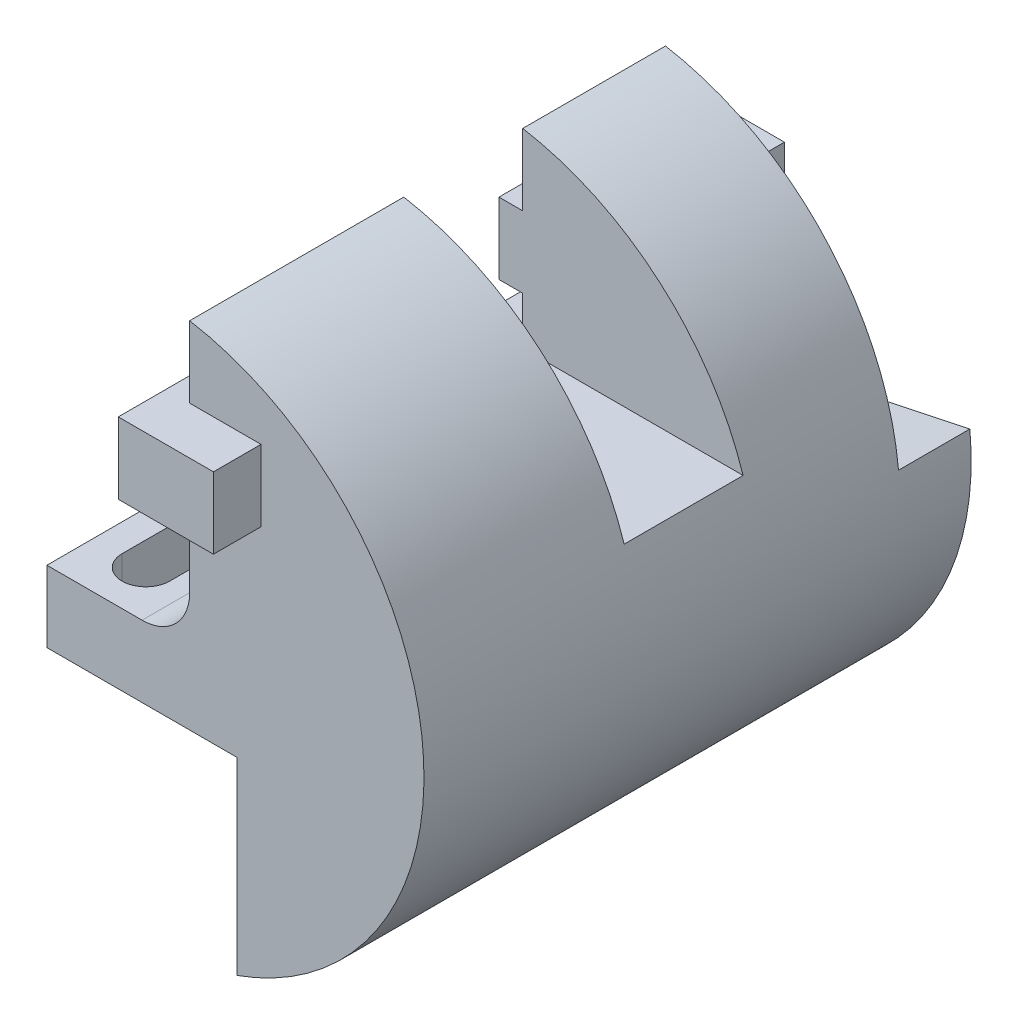
ISO-10303-21;
HEADER;
FILE_DESCRIPTION(('STEP AP214'),'2;1');
FILE_NAME('part.step','',(''),(''),'','','');
FILE_SCHEMA(('AUTOMOTIVE_DESIGN { 1 0 10303 214 1 1 1 1 }'));
ENDSEC;
DATA;
#1=APPLICATION_CONTEXT('core data for automotive mechanical design processes');
#2=APPLICATION_PROTOCOL_DEFINITION('international standard','automotive_design',2000,#1);
#3=PRODUCT_CONTEXT('',#1,'mechanical');
#4=PRODUCT('Part','Part','',(#3));
#5=PRODUCT_RELATED_PRODUCT_CATEGORY('part','',(#4));
#6=PRODUCT_DEFINITION_FORMATION('','',#4);
#7=PRODUCT_DEFINITION_CONTEXT('part definition',#1,'design');
#8=PRODUCT_DEFINITION('design','',#6,#7);
#9=PRODUCT_DEFINITION_SHAPE('','',#8);
#10=(LENGTH_UNIT() NAMED_UNIT(*) SI_UNIT(.MILLI.,.METRE.));
#11=(NAMED_UNIT(*) PLANE_ANGLE_UNIT() SI_UNIT($,.RADIAN.));
#12=(NAMED_UNIT(*) SI_UNIT($,.STERADIAN.) SOLID_ANGLE_UNIT());
#13=UNCERTAINTY_MEASURE_WITH_UNIT(LENGTH_MEASURE(1.E-05),#10,'distance_accuracy_value','');
#14=(GEOMETRIC_REPRESENTATION_CONTEXT(3) GLOBAL_UNCERTAINTY_ASSIGNED_CONTEXT((#13)) GLOBAL_UNIT_ASSIGNED_CONTEXT((#10,
#11,#12)) REPRESENTATION_CONTEXT('',''));
#15=CARTESIAN_POINT('',(0.,0.,0.));
#16=DIRECTION('',(0.,0.,1.));
#17=DIRECTION('',(1.,0.,0.));
#18=AXIS2_PLACEMENT_3D('',#15,#16,#17);
#19=CARTESIAN_POINT('',(0.,0.,0.));
#20=DIRECTION('',(0.,0.,-1.));
#21=DIRECTION('',(-1.,0.,0.));
#22=AXIS2_PLACEMENT_3D('',#19,#20,#21);
#23=PLANE('',#22);
#24=CARTESIAN_POINT('',(0.,0.,0.));
#25=DIRECTION('',(0.,0.,1.));
#26=DIRECTION('',(-1.,0.,0.));
#27=AXIS2_PLACEMENT_3D('',#24,#25,#26);
#28=CIRCLE('',#27,59.25);
#29=CARTESIAN_POINT('',(58.9764421708089,5.68698240486387,0.));
#30=VERTEX_POINT('',#29);
#31=CARTESIAN_POINT('',(10.,58.4000214041057,0.));
#32=VERTEX_POINT('',#31);
#33=EDGE_CURVE('E329',#30,#32,#28,.T.);
#34=ORIENTED_EDGE('',*,*,#33,.F.);
#35=DIRECTION('',(0.978147600733806,0.207911690817756,0.));
#36=VECTOR('',#35,1.);
#37=CARTESIAN_POINT('',(1.39283859257965,-6.55279038029392,0.));
#38=LINE('',#37,#36);
#39=CARTESIAN_POINT('',(-20.,-11.0999785958943,0.));
#40=VERTEX_POINT('',#39);
#41=EDGE_CURVE('E485',#40,#30,#38,.T.);
#42=ORIENTED_EDGE('',*,*,#41,.F.);
#43=DIRECTION('',(0.,-1.,0.));
#44=VECTOR('',#43,1.);
#45=CARTESIAN_POINT('',(-20.,-1.09997859589433,0.));
#46=LINE('',#45,#44);
#47=CARTESIAN_POINT('',(-20.,-1.09997859589433,0.));
#48=VERTEX_POINT('',#47);
#49=EDGE_CURVE('E332',#48,#40,#46,.T.);
#50=ORIENTED_EDGE('',*,*,#49,.F.);
#51=DIRECTION('',(-1.,0.,0.));
#52=VECTOR('',#51,1.);
#53=CARTESIAN_POINT('',(-20.,-1.09997859589433,0.));
#54=LINE('',#53,#52);
#55=CARTESIAN_POINT('',(0.,-1.09997859589433,0.));
#56=VERTEX_POINT('',#55);
#57=EDGE_CURVE('E315',#56,#48,#54,.T.);
#58=ORIENTED_EDGE('',*,*,#57,.F.);
#59=CARTESIAN_POINT('',(0.,8.90002140410567,0.));
#60=DIRECTION('',(0.,0.,-1.));
#61=DIRECTION('',(1.,0.,0.));
#62=AXIS2_PLACEMENT_3D('',#59,#60,#61);
#63=CIRCLE('',#62,10.);
#64=CARTESIAN_POINT('',(10.,8.90002140410567,0.));
#65=VERTEX_POINT('',#64);
#66=EDGE_CURVE('E319',#65,#56,#63,.T.);
#67=ORIENTED_EDGE('',*,*,#66,.F.);
#68=DIRECTION('',(0.,-1.,0.));
#69=VECTOR('',#68,1.);
#70=CARTESIAN_POINT('',(10.,8.90002140410567,0.));
#71=LINE('',#70,#69);
#72=CARTESIAN_POINT('',(10.,28.4000214041057,0.));
#73=VERTEX_POINT('',#72);
#74=EDGE_CURVE('E322',#73,#65,#71,.T.);
#75=ORIENTED_EDGE('',*,*,#74,.F.);
#76=DIRECTION('',(-1.,0.,0.));
#77=VECTOR('',#76,1.);
#78=CARTESIAN_POINT('',(25.,28.4000214041057,0.));
#79=LINE('',#78,#77);
#80=CARTESIAN_POINT('',(25.,28.4000214041057,0.));
#81=VERTEX_POINT('',#80);
#82=EDGE_CURVE('E401',#81,#73,#79,.T.);
#83=ORIENTED_EDGE('',*,*,#82,.F.);
#84=DIRECTION('',(0.,-1.,0.));
#85=VECTOR('',#84,1.);
#86=CARTESIAN_POINT('',(25.,43.4000214041057,0.));
#87=LINE('',#86,#85);
#88=CARTESIAN_POINT('',(25.,43.4000214041057,0.));
#89=VERTEX_POINT('',#88);
#90=EDGE_CURVE('E406',#89,#81,#87,.T.);
#91=ORIENTED_EDGE('',*,*,#90,.F.);
#92=DIRECTION('',(1.,0.,0.));
#93=VECTOR('',#92,1.);
#94=CARTESIAN_POINT('',(5.,43.4000214041057,0.));
#95=LINE('',#94,#93);
#96=CARTESIAN_POINT('',(10.,43.4000214041057,0.));
#97=VERTEX_POINT('',#96);
#98=EDGE_CURVE('E266',#97,#89,#95,.T.);
#99=ORIENTED_EDGE('',*,*,#98,.F.);
#100=DIRECTION('',(0.,-1.,0.));
#101=VECTOR('',#100,1.);
#102=CARTESIAN_POINT('',(10.,43.4000214041057,0.));
#103=LINE('',#102,#101);
#104=EDGE_CURVE('E325',#32,#97,#103,.T.);
#105=ORIENTED_EDGE('',*,*,#104,.F.);
#106=EDGE_LOOP('',(#34,#42,#50,#58,#67,#75,#83,#91,#99,#105));
#107=FACE_BOUND('',#106,.T.);
#108=ADVANCED_FACE('F47',(#107),#23,.T.);
#109=CARTESIAN_POINT('',(10.,43.4000214041057,100.));
#110=DIRECTION('',(1.,0.,0.));
#111=DIRECTION('',(0.,1.,0.));
#112=AXIS2_PLACEMENT_3D('',#109,#110,#111);
#113=PLANE('',#112);
#114=DIRECTION('',(0.,0.,-1.));
#115=VECTOR('',#114,1.);
#116=CARTESIAN_POINT('',(10.,58.4000214041057,100.));
#117=LINE('',#116,#115);
#118=CARTESIAN_POINT('',(10.,58.4000214041057,100.));
#119=VERTEX_POINT('',#118);
#120=CARTESIAN_POINT('',(10.,58.4000214041057,55.));
#121=VERTEX_POINT('',#120);
#122=EDGE_CURVE('E277',#119,#121,#117,.T.);
#123=ORIENTED_EDGE('',*,*,#122,.T.);
#124=DIRECTION('',(0.,-1.,0.));
#125=VECTOR('',#124,1.);
#126=CARTESIAN_POINT('',(10.,43.4000214041057,55.));
#127=LINE('',#126,#125);
#128=CARTESIAN_POINT('',(10.,43.4000214041057,55.));
#129=VERTEX_POINT('',#128);
#130=EDGE_CURVE('E429',#121,#129,#127,.T.);
#131=ORIENTED_EDGE('',*,*,#130,.T.);
#132=DIRECTION('',(0.,0.,-1.));
#133=VECTOR('',#132,1.);
#134=CARTESIAN_POINT('',(10.,43.4000214041057,100.));
#135=LINE('',#134,#133);
#136=CARTESIAN_POINT('',(10.,43.4000214041057,100.));
#137=VERTEX_POINT('',#136);
#138=EDGE_CURVE('E282',#137,#129,#135,.T.);
#139=ORIENTED_EDGE('',*,*,#138,.F.);
#140=DIRECTION('',(0.,-1.,0.));
#141=VECTOR('',#140,1.);
#142=CARTESIAN_POINT('',(10.,43.4000214041057,100.));
#143=LINE('',#142,#141);
#144=EDGE_CURVE('E345',#119,#137,#143,.T.);
#145=ORIENTED_EDGE('',*,*,#144,.F.);
#146=EDGE_LOOP('',(#123,#131,#139,#145));
#147=FACE_BOUND('',#146,.T.);
#148=ADVANCED_FACE('F610',(#147),#113,.F.);
#149=CARTESIAN_POINT('',(5.,43.4000214041057,100.));
#150=DIRECTION('',(0.,-1.,0.));
#151=DIRECTION('',(0.,0.,-1.));
#152=AXIS2_PLACEMENT_3D('',#149,#150,#151);
#153=PLANE('',#152);
#154=ORIENTED_EDGE('',*,*,#138,.T.);
#155=DIRECTION('',(-1.,0.,0.));
#156=VECTOR('',#155,1.);
#157=CARTESIAN_POINT('',(5.,43.4000214041057,55.));
#158=LINE('',#157,#156);
#159=CARTESIAN_POINT('',(5.,43.4000214041057,55.));
#160=VERTEX_POINT('',#159);
#161=EDGE_CURVE('E433',#129,#160,#158,.T.);
#162=ORIENTED_EDGE('',*,*,#161,.T.);
#163=DIRECTION('',(0.,0.,-1.));
#164=VECTOR('',#163,1.);
#165=CARTESIAN_POINT('',(5.,43.4000214041057,100.));
#166=LINE('',#165,#164);
#167=CARTESIAN_POINT('',(5.,43.4000214041057,110.));
#168=VERTEX_POINT('',#167);
#169=EDGE_CURVE('E287',#168,#160,#166,.T.);
#170=ORIENTED_EDGE('',*,*,#169,.F.);
#171=DIRECTION('',(-1.,0.,0.));
#172=VECTOR('',#171,1.);
#173=CARTESIAN_POINT('',(5.,43.4000214041057,110.));
#174=LINE('',#173,#172);
#175=CARTESIAN_POINT('',(25.,43.4000214041057,110.));
#176=VERTEX_POINT('',#175);
#177=EDGE_CURVE('E367',#176,#168,#174,.T.);
#178=ORIENTED_EDGE('',*,*,#177,.F.);
#179=DIRECTION('',(0.,0.,-1.));
#180=VECTOR('',#179,1.);
#181=CARTESIAN_POINT('',(25.,43.4000214041057,110.));
#182=LINE('',#181,#180);
#183=CARTESIAN_POINT('',(25.,43.4000214041057,100.));
#184=VERTEX_POINT('',#183);
#185=EDGE_CURVE('E363',#176,#184,#182,.T.);
#186=ORIENTED_EDGE('',*,*,#185,.T.);
#187=DIRECTION('',(-1.,0.,0.));
#188=VECTOR('',#187,1.);
#189=CARTESIAN_POINT('',(5.,43.4000214041057,100.));
#190=LINE('',#189,#188);
#191=EDGE_CURVE('E368',#184,#137,#190,.T.);
#192=ORIENTED_EDGE('',*,*,#191,.T.);
#193=EDGE_LOOP('',(#154,#162,#170,#178,#186,#192));
#194=FACE_BOUND('',#193,.T.);
#195=ADVANCED_FACE('F616',(#194),#153,.F.);
#196=CARTESIAN_POINT('',(5.,28.4000214041057,100.));
#197=DIRECTION('',(1.,0.,0.));
#198=DIRECTION('',(0.,0.,-1.));
#199=AXIS2_PLACEMENT_3D('',#196,#197,#198);
#200=PLANE('',#199);
#201=ORIENTED_EDGE('',*,*,#169,.T.);
#202=DIRECTION('',(0.,-1.,0.));
#203=VECTOR('',#202,1.);
#204=CARTESIAN_POINT('',(5.,28.4000214041057,55.));
#205=LINE('',#204,#203);
#206=CARTESIAN_POINT('',(5.,28.4000214041057,55.));
#207=VERTEX_POINT('',#206);
#208=EDGE_CURVE('E437',#160,#207,#205,.T.);
#209=ORIENTED_EDGE('',*,*,#208,.T.);
#210=DIRECTION('',(0.,0.,-1.));
#211=VECTOR('',#210,1.);
#212=CARTESIAN_POINT('',(5.,28.4000214041057,100.));
#213=LINE('',#212,#211);
#214=CARTESIAN_POINT('',(5.,28.4000214041057,110.));
#215=VERTEX_POINT('',#214);
#216=EDGE_CURVE('E292',#215,#207,#213,.T.);
#217=ORIENTED_EDGE('',*,*,#216,.F.);
#218=DIRECTION('',(0.,-1.,0.));
#219=VECTOR('',#218,1.);
#220=CARTESIAN_POINT('',(5.,28.4000214041057,110.));
#221=LINE('',#220,#219);
#222=EDGE_CURVE('E372',#168,#215,#221,.T.);
#223=ORIENTED_EDGE('',*,*,#222,.F.);
#224=EDGE_LOOP('',(#201,#209,#217,#223));
#225=FACE_BOUND('',#224,.T.);
#226=ADVANCED_FACE('F637',(#225),#200,.F.);
#227=CARTESIAN_POINT('',(10.,28.4000214041057,100.));
#228=DIRECTION('',(0.,1.,0.));
#229=DIRECTION('',(0.,0.,1.));
#230=AXIS2_PLACEMENT_3D('',#227,#228,#229);
#231=PLANE('',#230);
#232=ORIENTED_EDGE('',*,*,#216,.T.);
#233=DIRECTION('',(1.,0.,0.));
#234=VECTOR('',#233,1.);
#235=CARTESIAN_POINT('',(10.,28.4000214041057,55.));
#236=LINE('',#235,#234);
#237=CARTESIAN_POINT('',(10.,28.4000214041057,55.));
#238=VERTEX_POINT('',#237);
#239=EDGE_CURVE('E441',#207,#238,#236,.T.);
#240=ORIENTED_EDGE('',*,*,#239,.T.);
#241=DIRECTION('',(0.,0.,-1.));
#242=VECTOR('',#241,1.);
#243=CARTESIAN_POINT('',(10.,28.4000214041057,100.));
#244=LINE('',#243,#242);
#245=CARTESIAN_POINT('',(10.,28.4000214041057,100.));
#246=VERTEX_POINT('',#245);
#247=EDGE_CURVE('E297',#246,#238,#244,.T.);
#248=ORIENTED_EDGE('',*,*,#247,.F.);
#249=DIRECTION('',(1.,0.,0.));
#250=VECTOR('',#249,1.);
#251=CARTESIAN_POINT('',(25.,28.4000214041057,100.));
#252=LINE('',#251,#250);
#253=CARTESIAN_POINT('',(25.,28.4000214041057,100.));
#254=VERTEX_POINT('',#253);
#255=EDGE_CURVE('E270',#246,#254,#252,.T.);
#256=ORIENTED_EDGE('',*,*,#255,.T.);
#257=DIRECTION('',(0.,0.,-1.));
#258=VECTOR('',#257,1.);
#259=CARTESIAN_POINT('',(25.,28.4000214041057,110.));
#260=LINE('',#259,#258);
#261=CARTESIAN_POINT('',(25.,28.4000214041057,110.));
#262=VERTEX_POINT('',#261);
#263=EDGE_CURVE('E336',#262,#254,#260,.T.);
#264=ORIENTED_EDGE('',*,*,#263,.F.);
#265=DIRECTION('',(1.,0.,0.));
#266=VECTOR('',#265,1.);
#267=CARTESIAN_POINT('',(25.,28.4000214041057,110.));
#268=LINE('',#267,#266);
#269=EDGE_CURVE('E387',#215,#262,#268,.T.);
#270=ORIENTED_EDGE('',*,*,#269,.F.);
#271=EDGE_LOOP('',(#232,#240,#248,#256,#264,#270));
#272=FACE_BOUND('',#271,.T.);
#273=ADVANCED_FACE('F634',(#272),#231,.F.);
#274=CARTESIAN_POINT('',(0.,0.,100.));
#275=DIRECTION('',(0.,0.,-1.));
#276=DIRECTION('',(-1.,0.,0.));
#277=AXIS2_PLACEMENT_3D('',#274,#275,#276);
#278=PLANE('',#277);
#279=ORIENTED_EDGE('',*,*,#191,.F.);
#280=DIRECTION('',(0.,1.,0.));
#281=VECTOR('',#280,1.);
#282=CARTESIAN_POINT('',(25.,43.4000214041057,100.));
#283=LINE('',#282,#281);
#284=EDGE_CURVE('E373',#254,#184,#283,.T.);
#285=ORIENTED_EDGE('',*,*,#284,.F.);
#286=ORIENTED_EDGE('',*,*,#255,.F.);
#287=DIRECTION('',(0.,-1.,0.));
#288=VECTOR('',#287,1.);
#289=CARTESIAN_POINT('',(10.,8.90002140410567,100.));
#290=LINE('',#289,#288);
#291=CARTESIAN_POINT('',(10.,8.90002140410567,100.));
#292=VERTEX_POINT('',#291);
#293=EDGE_CURVE('E342',#246,#292,#290,.T.);
#294=ORIENTED_EDGE('',*,*,#293,.T.);
#295=CARTESIAN_POINT('',(0.,8.90002140410567,100.));
#296=DIRECTION('',(0.,0.,-1.));
#297=DIRECTION('',(1.,0.,0.));
#298=AXIS2_PLACEMENT_3D('',#295,#296,#297);
#299=CIRCLE('',#298,10.);
#300=CARTESIAN_POINT('',(0.,-1.09997859589433,100.));
#301=VERTEX_POINT('',#300);
#302=EDGE_CURVE('E339',#292,#301,#299,.T.);
#303=ORIENTED_EDGE('',*,*,#302,.T.);
#304=DIRECTION('',(-1.,0.,0.));
#305=VECTOR('',#304,1.);
#306=CARTESIAN_POINT('',(-20.,-1.09997859589433,100.));
#307=LINE('',#306,#305);
#308=CARTESIAN_POINT('',(-20.,-1.09997859589433,100.));
#309=VERTEX_POINT('',#308);
#310=EDGE_CURVE('E314',#301,#309,#307,.T.);
#311=ORIENTED_EDGE('',*,*,#310,.T.);
#312=DIRECTION('',(0.,-1.,0.));
#313=VECTOR('',#312,1.);
#314=CARTESIAN_POINT('',(-20.,-1.09997859589433,100.));
#315=LINE('',#314,#313);
#316=CARTESIAN_POINT('',(-20.,-16.0999785958943,100.));
#317=VERTEX_POINT('',#316);
#318=EDGE_CURVE('E318',#309,#317,#315,.T.);
#319=ORIENTED_EDGE('',*,*,#318,.T.);
#320=DIRECTION('',(1.,0.,0.));
#321=VECTOR('',#320,1.);
#322=CARTESIAN_POINT('',(-20.,-16.0999785958943,100.));
#323=LINE('',#322,#321);
#324=CARTESIAN_POINT('',(20.,-16.0999785958943,100.));
#325=VERTEX_POINT('',#324);
#326=EDGE_CURVE('E354',#317,#325,#323,.T.);
#327=ORIENTED_EDGE('',*,*,#326,.T.);
#328=DIRECTION('',(0.,-1.,0.));
#329=VECTOR('',#328,1.);
#330=CARTESIAN_POINT('',(20.,-16.0999785958943,100.));
#331=LINE('',#330,#329);
#332=CARTESIAN_POINT('',(20.,-55.7724170177338,100.));
#333=VERTEX_POINT('',#332);
#334=EDGE_CURVE('E351',#325,#333,#331,.T.);
#335=ORIENTED_EDGE('',*,*,#334,.T.);
#336=CARTESIAN_POINT('',(0.,0.,100.));
#337=DIRECTION('',(0.,0.,1.));
#338=DIRECTION('',(-1.,0.,0.));
#339=AXIS2_PLACEMENT_3D('',#336,#337,#338);
#340=CIRCLE('',#339,59.25);
#341=EDGE_CURVE('E348',#333,#119,#340,.T.);
#342=ORIENTED_EDGE('',*,*,#341,.T.);
#343=ORIENTED_EDGE('',*,*,#144,.T.);
#344=EDGE_LOOP('',(#279,#285,#286,#294,#303,#311,#319,#327,#335,#342,#343));
#345=FACE_BOUND('',#344,.T.);
#346=ADVANCED_FACE('F621',(#345),#278,.F.);
#347=CARTESIAN_POINT('',(-20.,-1.09997859589433,100.));
#348=DIRECTION('',(1.,0.,0.));
#349=DIRECTION('',(0.,1.,0.));
#350=AXIS2_PLACEMENT_3D('',#347,#348,#349);
#351=PLANE('',#350);
#352=ORIENTED_EDGE('',*,*,#49,.T.);
#353=DIRECTION('',(0.,0.,1.));
#354=VECTOR('',#353,1.);
#355=CARTESIAN_POINT('',(-20.,-11.0999785958943,-15.));
#356=LINE('',#355,#354);
#357=CARTESIAN_POINT('',(-20.,-11.0999785958943,-15.));
#358=VERTEX_POINT('',#357);
#359=EDGE_CURVE('E474',#358,#40,#356,.T.);
#360=ORIENTED_EDGE('',*,*,#359,.F.);
#361=DIRECTION('',(0.,1.,0.));
#362=VECTOR('',#361,1.);
#363=CARTESIAN_POINT('',(-20.,0.,-15.));
#364=LINE('',#363,#362);
#365=CARTESIAN_POINT('',(-20.,-16.0999785958943,-15.));
#366=VERTEX_POINT('',#365);
#367=EDGE_CURVE('E488',#366,#358,#364,.T.);
#368=ORIENTED_EDGE('',*,*,#367,.F.);
#369=DIRECTION('',(0.,0.,-1.));
#370=VECTOR('',#369,1.);
#371=CARTESIAN_POINT('',(-20.,-16.0999785958943,100.));
#372=LINE('',#371,#370);
#373=EDGE_CURVE('E267',#317,#366,#372,.T.);
#374=ORIENTED_EDGE('',*,*,#373,.F.);
#375=ORIENTED_EDGE('',*,*,#318,.F.);
#376=DIRECTION('',(0.,0.,-1.));
#377=VECTOR('',#376,1.);
#378=CARTESIAN_POINT('',(-20.,-1.09997859589433,100.));
#379=LINE('',#378,#377);
#380=EDGE_CURVE('E310',#309,#48,#379,.T.);
#381=ORIENTED_EDGE('',*,*,#380,.T.);
#382=EDGE_LOOP('',(#352,#360,#368,#374,#375,#381));
#383=FACE_BOUND('',#382,.T.);
#384=ADVANCED_FACE('F49',(#383),#351,.F.);
#385=CARTESIAN_POINT('',(-20.,-16.0999785958943,100.));
#386=DIRECTION('',(0.,1.,0.));
#387=DIRECTION('',(0.,0.,1.));
#388=AXIS2_PLACEMENT_3D('',#385,#386,#387);
#389=PLANE('',#388);
#390=DIRECTION('',(0.,0.,-1.));
#391=VECTOR('',#390,1.);
#392=CARTESIAN_POINT('',(-4.20198133159444,-16.0999785958943,100.));
#393=LINE('',#392,#391);
#394=CARTESIAN_POINT('',(-4.20198133159444,-16.0999785958943,90.));
#395=VERTEX_POINT('',#394);
#396=CARTESIAN_POINT('',(-4.20198133159445,-16.0999785958943,10.));
#397=VERTEX_POINT('',#396);
#398=EDGE_CURVE('E510',#395,#397,#393,.T.);
#399=ORIENTED_EDGE('',*,*,#398,.T.);
#400=CARTESIAN_POINT('',(-9.20198133159445,-16.0999785958943,10.));
#401=DIRECTION('',(0.,1.,0.));
#402=DIRECTION('',(0.,0.,1.));
#403=AXIS2_PLACEMENT_3D('',#400,#401,#402);
#404=CIRCLE('',#403,5.);
#405=CARTESIAN_POINT('',(-14.2019813315944,-16.0999785958943,10.));
#406=VERTEX_POINT('',#405);
#407=EDGE_CURVE('E489',#397,#406,#404,.T.);
#408=ORIENTED_EDGE('',*,*,#407,.T.);
#409=DIRECTION('',(0.,0.,1.));
#410=VECTOR('',#409,1.);
#411=CARTESIAN_POINT('',(-14.2019813315944,-16.0999785958943,100.));
#412=LINE('',#411,#410);
#413=CARTESIAN_POINT('',(-14.2019813315944,-16.0999785958943,90.));
#414=VERTEX_POINT('',#413);
#415=EDGE_CURVE('E516',#406,#414,#412,.T.);
#416=ORIENTED_EDGE('',*,*,#415,.T.);
#417=CARTESIAN_POINT('',(-9.20198133159444,-16.0999785958943,90.));
#418=DIRECTION('',(0.,1.,0.));
#419=DIRECTION('',(0.,0.,1.));
#420=AXIS2_PLACEMENT_3D('',#417,#418,#419);
#421=CIRCLE('',#420,5.);
#422=EDGE_CURVE('E243',#414,#395,#421,.T.);
#423=ORIENTED_EDGE('',*,*,#422,.T.);
#424=EDGE_LOOP('',(#399,#408,#416,#423));
#425=FACE_BOUND('',#424,.T.);
#426=ORIENTED_EDGE('',*,*,#373,.T.);
#427=DIRECTION('',(-1.,0.,0.));
#428=VECTOR('',#427,1.);
#429=CARTESIAN_POINT('',(0.,-16.0999785958943,-15.));
#430=LINE('',#429,#428);
#431=CARTESIAN_POINT('',(20.,-16.0999785958943,-15.));
#432=VERTEX_POINT('',#431);
#433=EDGE_CURVE('E484',#432,#366,#430,.T.);
#434=ORIENTED_EDGE('',*,*,#433,.F.);
#435=DIRECTION('',(0.,0.,-1.));
#436=VECTOR('',#435,1.);
#437=CARTESIAN_POINT('',(20.,-16.0999785958943,100.));
#438=LINE('',#437,#436);
#439=EDGE_CURVE('E271',#325,#432,#438,.T.);
#440=ORIENTED_EDGE('',*,*,#439,.F.);
#441=ORIENTED_EDGE('',*,*,#326,.F.);
#442=EDGE_LOOP('',(#426,#434,#440,#441));
#443=FACE_BOUND('',#442,.T.);
#444=ADVANCED_FACE('F532',(#425,#443),#389,.F.);
#445=CARTESIAN_POINT('',(20.,-16.0999785958943,100.));
#446=DIRECTION('',(1.,0.,0.));
#447=DIRECTION('',(0.,1.,0.));
#448=AXIS2_PLACEMENT_3D('',#445,#446,#447);
#449=PLANE('',#448);
#450=ORIENTED_EDGE('',*,*,#439,.T.);
#451=DIRECTION('',(0.,1.,0.));
#452=VECTOR('',#451,1.);
#453=CARTESIAN_POINT('',(20.,0.,-15.));
#454=LINE('',#453,#452);
#455=CARTESIAN_POINT('',(20.,-55.7724170177338,-15.));
#456=VERTEX_POINT('',#455);
#457=EDGE_CURVE('E493',#456,#432,#454,.T.);
#458=ORIENTED_EDGE('',*,*,#457,.F.);
#459=DIRECTION('',(0.,0.,-1.));
#460=VECTOR('',#459,1.);
#461=CARTESIAN_POINT('',(20.,-55.7724170177338,100.));
#462=LINE('',#461,#460);
#463=EDGE_CURVE('E274',#333,#456,#462,.T.);
#464=ORIENTED_EDGE('',*,*,#463,.F.);
#465=ORIENTED_EDGE('',*,*,#334,.F.);
#466=EDGE_LOOP('',(#450,#458,#464,#465));
#467=FACE_BOUND('',#466,.T.);
#468=ADVANCED_FACE('F535',(#467),#449,.F.);
#469=CARTESIAN_POINT('',(0.,0.,100.));
#470=DIRECTION('',(0.,0.,-1.));
#471=DIRECTION('',(-1.,0.,0.));
#472=AXIS2_PLACEMENT_3D('',#469,#470,#471);
#473=CYLINDRICAL_SURFACE('',#472,59.25);
#474=DIRECTION('',(0.,0.,-1.));
#475=VECTOR('',#474,1.);
#476=CARTESIAN_POINT('',(56.3205265629544,18.4000214041057,100.));
#477=LINE('',#476,#475);
#478=CARTESIAN_POINT('',(56.3205265629544,18.4000214041057,30.));
#479=VERTEX_POINT('',#478);
#480=CARTESIAN_POINT('',(56.3205265629544,18.4000214041057,55.));
#481=VERTEX_POINT('',#480);
#482=EDGE_CURVE('E445',#479,#481,#477,.F.);
#483=ORIENTED_EDGE('',*,*,#482,.T.);
#484=CARTESIAN_POINT('',(0.,0.,55.));
#485=DIRECTION('',(0.,0.,1.));
#486=DIRECTION('',(1.,0.,0.));
#487=AXIS2_PLACEMENT_3D('',#484,#485,#486);
#488=CIRCLE('',#487,59.25);
#489=EDGE_CURVE('E410',#481,#121,#488,.T.);
#490=ORIENTED_EDGE('',*,*,#489,.T.);
#491=ORIENTED_EDGE('',*,*,#122,.F.);
#492=ORIENTED_EDGE('',*,*,#341,.F.);
#493=ORIENTED_EDGE('',*,*,#463,.T.);
#494=CARTESIAN_POINT('',(0.,0.,-15.));
#495=DIRECTION('',(0.,0.,-1.));
#496=DIRECTION('',(-1.,0.,0.));
#497=AXIS2_PLACEMENT_3D('',#494,#495,#496);
#498=CIRCLE('',#497,59.25);
#499=CARTESIAN_POINT('',(58.9764421708089,5.68698240486387,-15.));
#500=VERTEX_POINT('',#499);
#501=EDGE_CURVE('E497',#500,#456,#498,.T.);
#502=ORIENTED_EDGE('',*,*,#501,.F.);
#503=DIRECTION('',(0.,0.,1.));
#504=VECTOR('',#503,1.);
#505=CARTESIAN_POINT('',(58.9764421708089,5.68698240486387,-15.));
#506=LINE('',#505,#504);
#507=EDGE_CURVE('E480',#500,#30,#506,.T.);
#508=ORIENTED_EDGE('',*,*,#507,.T.);
#509=ORIENTED_EDGE('',*,*,#33,.T.);
#510=CARTESIAN_POINT('',(10.,58.4000214041057,30.));
#511=VERTEX_POINT('',#510);
#512=EDGE_CURVE('E281',#511,#32,#117,.T.);
#513=ORIENTED_EDGE('',*,*,#512,.F.);
#514=CARTESIAN_POINT('',(0.,0.,30.));
#515=DIRECTION('',(0.,0.,-1.));
#516=DIRECTION('',(0.,1.,0.));
#517=AXIS2_PLACEMENT_3D('',#514,#515,#516);
#518=CIRCLE('',#517,59.25);
#519=EDGE_CURVE('E449',#511,#479,#518,.T.);
#520=ORIENTED_EDGE('',*,*,#519,.T.);
#521=EDGE_LOOP('',(#483,#490,#491,#492,#493,#502,#508,#509,#513,#520));
#522=FACE_BOUND('',#521,.T.);
#523=ADVANCED_FACE('F559',(#522),#473,.T.);
#524=CARTESIAN_POINT('',(10.,43.4000214041057,30.));
#525=VERTEX_POINT('',#524);
#526=EDGE_CURVE('E286',#525,#97,#135,.T.);
#527=ORIENTED_EDGE('',*,*,#526,.F.);
#528=DIRECTION('',(0.,1.,0.));
#529=VECTOR('',#528,1.);
#530=CARTESIAN_POINT('',(10.,43.4000214041057,30.));
#531=LINE('',#530,#529);
#532=EDGE_CURVE('E453',#525,#511,#531,.T.);
#533=ORIENTED_EDGE('',*,*,#532,.T.);
#534=ORIENTED_EDGE('',*,*,#512,.T.);
#535=ORIENTED_EDGE('',*,*,#104,.T.);
#536=EDGE_LOOP('',(#527,#533,#534,#535));
#537=FACE_BOUND('',#536,.T.);
#538=ADVANCED_FACE('F563',(#537),#113,.F.);
#539=CARTESIAN_POINT('',(5.,43.4000214041057,30.));
#540=VERTEX_POINT('',#539);
#541=CARTESIAN_POINT('',(5.,43.4000214041057,-10.));
#542=VERTEX_POINT('',#541);
#543=EDGE_CURVE('E291',#540,#542,#166,.T.);
#544=ORIENTED_EDGE('',*,*,#543,.F.);
#545=DIRECTION('',(1.,0.,0.));
#546=VECTOR('',#545,1.);
#547=CARTESIAN_POINT('',(5.,43.4000214041057,30.));
#548=LINE('',#547,#546);
#549=EDGE_CURVE('E457',#540,#525,#548,.T.);
#550=ORIENTED_EDGE('',*,*,#549,.T.);
#551=ORIENTED_EDGE('',*,*,#526,.T.);
#552=ORIENTED_EDGE('',*,*,#98,.T.);
#553=DIRECTION('',(0.,0.,1.));
#554=VECTOR('',#553,1.);
#555=CARTESIAN_POINT('',(25.,43.4000214041057,-10.));
#556=LINE('',#555,#554);
#557=CARTESIAN_POINT('',(25.,43.4000214041057,-10.));
#558=VERTEX_POINT('',#557);
#559=EDGE_CURVE('E377',#558,#89,#556,.T.);
#560=ORIENTED_EDGE('',*,*,#559,.F.);
#561=DIRECTION('',(1.,0.,0.));
#562=VECTOR('',#561,1.);
#563=CARTESIAN_POINT('',(5.,43.4000214041057,-10.));
#564=LINE('',#563,#562);
#565=EDGE_CURVE('E420',#542,#558,#564,.T.);
#566=ORIENTED_EDGE('',*,*,#565,.F.);
#567=EDGE_LOOP('',(#544,#550,#551,#552,#560,#566));
#568=FACE_BOUND('',#567,.T.);
#569=ADVANCED_FACE('F585',(#568),#153,.F.);
#570=CARTESIAN_POINT('',(5.,28.4000214041057,30.));
#571=VERTEX_POINT('',#570);
#572=CARTESIAN_POINT('',(5.,28.4000214041057,-10.));
#573=VERTEX_POINT('',#572);
#574=EDGE_CURVE('E296',#571,#573,#213,.T.);
#575=ORIENTED_EDGE('',*,*,#574,.F.);
#576=DIRECTION('',(0.,1.,0.));
#577=VECTOR('',#576,1.);
#578=CARTESIAN_POINT('',(5.,28.4000214041057,30.));
#579=LINE('',#578,#577);
#580=EDGE_CURVE('E461',#571,#540,#579,.T.);
#581=ORIENTED_EDGE('',*,*,#580,.T.);
#582=ORIENTED_EDGE('',*,*,#543,.T.);
#583=DIRECTION('',(0.,1.,0.));
#584=VECTOR('',#583,1.);
#585=CARTESIAN_POINT('',(5.,28.4000214041057,-10.));
#586=LINE('',#585,#584);
#587=EDGE_CURVE('E405',#573,#542,#586,.T.);
#588=ORIENTED_EDGE('',*,*,#587,.F.);
#589=EDGE_LOOP('',(#575,#581,#582,#588));
#590=FACE_BOUND('',#589,.T.);
#591=ADVANCED_FACE('F591',(#590),#200,.F.);
#592=CARTESIAN_POINT('',(10.,28.4000214041057,30.));
#593=VERTEX_POINT('',#592);
#594=EDGE_CURVE('E301',#593,#73,#244,.T.);
#595=ORIENTED_EDGE('',*,*,#594,.F.);
#596=DIRECTION('',(-1.,0.,0.));
#597=VECTOR('',#596,1.);
#598=CARTESIAN_POINT('',(10.,28.4000214041057,30.));
#599=LINE('',#598,#597);
#600=EDGE_CURVE('E465',#593,#571,#599,.T.);
#601=ORIENTED_EDGE('',*,*,#600,.T.);
#602=ORIENTED_EDGE('',*,*,#574,.T.);
#603=DIRECTION('',(-1.,0.,0.));
#604=VECTOR('',#603,1.);
#605=CARTESIAN_POINT('',(25.,28.4000214041057,-10.));
#606=LINE('',#605,#604);
#607=CARTESIAN_POINT('',(25.,28.4000214041057,-10.));
#608=VERTEX_POINT('',#607);
#609=EDGE_CURVE('E400',#608,#573,#606,.T.);
#610=ORIENTED_EDGE('',*,*,#609,.F.);
#611=DIRECTION('',(0.,0.,1.));
#612=VECTOR('',#611,1.);
#613=CARTESIAN_POINT('',(25.,28.4000214041057,-10.));
#614=LINE('',#613,#612);
#615=EDGE_CURVE('E396',#608,#81,#614,.T.);
#616=ORIENTED_EDGE('',*,*,#615,.T.);
#617=ORIENTED_EDGE('',*,*,#82,.T.);
#618=EDGE_LOOP('',(#595,#601,#602,#610,#616,#617));
#619=FACE_BOUND('',#618,.T.);
#620=ADVANCED_FACE('F576',(#619),#231,.F.);
#621=CARTESIAN_POINT('',(10.,8.90002140410567,100.));
#622=DIRECTION('',(1.,0.,0.));
#623=DIRECTION('',(0.,1.,0.));
#624=AXIS2_PLACEMENT_3D('',#621,#622,#623);
#625=PLANE('',#624);
#626=ORIENTED_EDGE('',*,*,#247,.T.);
#627=DIRECTION('',(0.,-1.,0.));
#628=VECTOR('',#627,1.);
#629=CARTESIAN_POINT('',(10.,8.90002140410567,55.));
#630=LINE('',#629,#628);
#631=CARTESIAN_POINT('',(10.,18.4000214041057,55.));
#632=VERTEX_POINT('',#631);
#633=EDGE_CURVE('E236',#238,#632,#630,.T.);
#634=ORIENTED_EDGE('',*,*,#633,.T.);
#635=DIRECTION('',(0.,0.,-1.));
#636=VECTOR('',#635,1.);
#637=CARTESIAN_POINT('',(10.,18.4000214041057,100.));
#638=LINE('',#637,#636);
#639=CARTESIAN_POINT('',(10.,18.4000214041057,30.));
#640=VERTEX_POINT('',#639);
#641=EDGE_CURVE('E258',#632,#640,#638,.T.);
#642=ORIENTED_EDGE('',*,*,#641,.T.);
#643=DIRECTION('',(0.,1.,0.));
#644=VECTOR('',#643,1.);
#645=CARTESIAN_POINT('',(10.,8.90002140410566,30.));
#646=LINE('',#645,#644);
#647=EDGE_CURVE('E262',#640,#593,#646,.T.);
#648=ORIENTED_EDGE('',*,*,#647,.T.);
#649=ORIENTED_EDGE('',*,*,#594,.T.);
#650=ORIENTED_EDGE('',*,*,#74,.T.);
#651=DIRECTION('',(0.,0.,-1.));
#652=VECTOR('',#651,1.);
#653=CARTESIAN_POINT('',(10.,8.90002140410567,100.));
#654=LINE('',#653,#652);
#655=EDGE_CURVE('E302',#292,#65,#654,.T.);
#656=ORIENTED_EDGE('',*,*,#655,.F.);
#657=ORIENTED_EDGE('',*,*,#293,.F.);
#658=EDGE_LOOP('',(#626,#634,#642,#648,#649,#650,#656,#657));
#659=FACE_BOUND('',#658,.T.);
#660=ADVANCED_FACE('F572',(#659),#625,.F.);
#661=CARTESIAN_POINT('',(0.,8.90002140410567,100.));
#662=DIRECTION('',(0.,0.,-1.));
#663=DIRECTION('',(-1.,0.,0.));
#664=AXIS2_PLACEMENT_3D('',#661,#662,#663);
#665=CYLINDRICAL_SURFACE('',#664,10.);
#666=ORIENTED_EDGE('',*,*,#66,.T.);
#667=DIRECTION('',(0.,0.,-1.));
#668=VECTOR('',#667,1.);
#669=CARTESIAN_POINT('',(0.,-1.09997859589433,100.));
#670=LINE('',#669,#668);
#671=EDGE_CURVE('E306',#301,#56,#670,.T.);
#672=ORIENTED_EDGE('',*,*,#671,.F.);
#673=ORIENTED_EDGE('',*,*,#302,.F.);
#674=ORIENTED_EDGE('',*,*,#655,.T.);
#675=EDGE_LOOP('',(#666,#672,#673,#674));
#676=FACE_BOUND('',#675,.T.);
#677=ADVANCED_FACE('F626',(#676),#665,.F.);
#678=CARTESIAN_POINT('',(-20.,-1.09997859589433,100.));
#679=DIRECTION('',(0.,-1.,0.));
#680=DIRECTION('',(0.,0.,-1.));
#681=AXIS2_PLACEMENT_3D('',#678,#679,#680);
#682=PLANE('',#681);
#683=DIRECTION('',(0.,0.,-1.));
#684=VECTOR('',#683,1.);
#685=CARTESIAN_POINT('',(-14.2019813315944,-1.09997859589433,100.));
#686=LINE('',#685,#684);
#687=CARTESIAN_POINT('',(-14.2019813315944,-1.09997859589433,90.));
#688=VERTEX_POINT('',#687);
#689=CARTESIAN_POINT('',(-14.2019813315944,-1.09997859589433,10.));
#690=VERTEX_POINT('',#689);
#691=EDGE_CURVE('E230',#688,#690,#686,.T.);
#692=ORIENTED_EDGE('',*,*,#691,.T.);
#693=CARTESIAN_POINT('',(-9.20198133159445,-1.09997859589433,10.));
#694=DIRECTION('',(0.,-1.,0.));
#695=DIRECTION('',(0.,0.,-1.));
#696=AXIS2_PLACEMENT_3D('',#693,#694,#695);
#697=CIRCLE('',#696,5.);
#698=CARTESIAN_POINT('',(-4.20198133159445,-1.09997859589433,10.));
#699=VERTEX_POINT('',#698);
#700=EDGE_CURVE('E11',#690,#699,#697,.T.);
#701=ORIENTED_EDGE('',*,*,#700,.T.);
#702=DIRECTION('',(0.,0.,1.));
#703=VECTOR('',#702,1.);
#704=CARTESIAN_POINT('',(-4.20198133159444,-1.09997859589433,100.));
#705=LINE('',#704,#703);
#706=CARTESIAN_POINT('',(-4.20198133159444,-1.09997859589433,90.));
#707=VERTEX_POINT('',#706);
#708=EDGE_CURVE('E56',#699,#707,#705,.T.);
#709=ORIENTED_EDGE('',*,*,#708,.T.);
#710=CARTESIAN_POINT('',(-9.20198133159444,-1.09997859589433,90.));
#711=DIRECTION('',(0.,-1.,0.));
#712=DIRECTION('',(0.,0.,-1.));
#713=AXIS2_PLACEMENT_3D('',#710,#711,#712);
#714=CIRCLE('',#713,5.);
#715=EDGE_CURVE('E235',#707,#688,#714,.T.);
#716=ORIENTED_EDGE('',*,*,#715,.T.);
#717=EDGE_LOOP('',(#692,#701,#709,#716));
#718=FACE_BOUND('',#717,.T.);
#719=ORIENTED_EDGE('',*,*,#57,.T.);
#720=ORIENTED_EDGE('',*,*,#380,.F.);
#721=ORIENTED_EDGE('',*,*,#310,.F.);
#722=ORIENTED_EDGE('',*,*,#671,.T.);
#723=EDGE_LOOP('',(#719,#720,#721,#722));
#724=FACE_BOUND('',#723,.T.);
#725=ADVANCED_FACE('F249',(#718,#724),#682,.F.);
#726=CARTESIAN_POINT('',(25.,43.4000214041057,110.));
#727=DIRECTION('',(-1.,0.,0.));
#728=DIRECTION('',(0.,-1.,0.));
#729=AXIS2_PLACEMENT_3D('',#726,#727,#728);
#730=PLANE('',#729);
#731=ORIENTED_EDGE('',*,*,#284,.T.);
#732=ORIENTED_EDGE('',*,*,#185,.F.);
#733=DIRECTION('',(0.,1.,0.));
#734=VECTOR('',#733,1.);
#735=CARTESIAN_POINT('',(25.,43.4000214041057,110.));
#736=LINE('',#735,#734);
#737=EDGE_CURVE('E384',#262,#176,#736,.T.);
#738=ORIENTED_EDGE('',*,*,#737,.F.);
#739=ORIENTED_EDGE('',*,*,#263,.T.);
#740=EDGE_LOOP('',(#731,#732,#738,#739));
#741=FACE_BOUND('',#740,.T.);
#742=ADVANCED_FACE('F625',(#741),#730,.F.);
#743=CARTESIAN_POINT('',(0.,0.,110.));
#744=DIRECTION('',(0.,0.,-1.));
#745=DIRECTION('',(-1.,0.,0.));
#746=AXIS2_PLACEMENT_3D('',#743,#744,#745);
#747=PLANE('',#746);
#748=ORIENTED_EDGE('',*,*,#222,.T.);
#749=ORIENTED_EDGE('',*,*,#269,.T.);
#750=ORIENTED_EDGE('',*,*,#737,.T.);
#751=ORIENTED_EDGE('',*,*,#177,.T.);
#752=EDGE_LOOP('',(#748,#749,#750,#751));
#753=FACE_BOUND('',#752,.T.);
#754=ADVANCED_FACE('F606',(#753),#747,.F.);
#755=CARTESIAN_POINT('',(25.,43.4000214041057,-10.));
#756=DIRECTION('',(-1.,0.,0.));
#757=DIRECTION('',(0.,-1.,0.));
#758=AXIS2_PLACEMENT_3D('',#755,#756,#757);
#759=PLANE('',#758);
#760=ORIENTED_EDGE('',*,*,#90,.T.);
#761=ORIENTED_EDGE('',*,*,#615,.F.);
#762=DIRECTION('',(0.,-1.,0.));
#763=VECTOR('',#762,1.);
#764=CARTESIAN_POINT('',(25.,43.4000214041057,-10.));
#765=LINE('',#764,#763);
#766=EDGE_CURVE('E417',#558,#608,#765,.T.);
#767=ORIENTED_EDGE('',*,*,#766,.F.);
#768=ORIENTED_EDGE('',*,*,#559,.T.);
#769=EDGE_LOOP('',(#760,#761,#767,#768));
#770=FACE_BOUND('',#769,.T.);
#771=ADVANCED_FACE('F581',(#770),#759,.F.);
#772=CARTESIAN_POINT('',(0.,0.,-10.));
#773=DIRECTION('',(0.,0.,-1.));
#774=DIRECTION('',(-1.,0.,0.));
#775=AXIS2_PLACEMENT_3D('',#772,#773,#774);
#776=PLANE('',#775);
#777=ORIENTED_EDGE('',*,*,#587,.T.);
#778=ORIENTED_EDGE('',*,*,#565,.T.);
#779=ORIENTED_EDGE('',*,*,#766,.T.);
#780=ORIENTED_EDGE('',*,*,#609,.T.);
#781=EDGE_LOOP('',(#777,#778,#779,#780));
#782=FACE_BOUND('',#781,.T.);
#783=ADVANCED_FACE('F594',(#782),#776,.T.);
#784=CARTESIAN_POINT('',(59.25,18.4000214041057,55.));
#785=DIRECTION('',(0.,0.,1.));
#786=DIRECTION('',(1.,0.,0.));
#787=AXIS2_PLACEMENT_3D('',#784,#785,#786);
#788=PLANE('',#787);
#789=DIRECTION('',(-1.,0.,0.));
#790=VECTOR('',#789,1.);
#791=CARTESIAN_POINT('',(59.25,18.4000214041057,55.));
#792=LINE('',#791,#790);
#793=EDGE_CURVE('E469',#481,#632,#792,.T.);
#794=ORIENTED_EDGE('',*,*,#793,.T.);
#795=ORIENTED_EDGE('',*,*,#633,.F.);
#796=ORIENTED_EDGE('',*,*,#239,.F.);
#797=ORIENTED_EDGE('',*,*,#208,.F.);
#798=ORIENTED_EDGE('',*,*,#161,.F.);
#799=ORIENTED_EDGE('',*,*,#130,.F.);
#800=ORIENTED_EDGE('',*,*,#489,.F.);
#801=EDGE_LOOP('',(#794,#795,#796,#797,#798,#799,#800));
#802=FACE_BOUND('',#801,.T.);
#803=ADVANCED_FACE('F596',(#802),#788,.F.);
#804=CARTESIAN_POINT('',(59.25,18.4000214041057,30.));
#805=DIRECTION('',(0.,-1.,0.));
#806=DIRECTION('',(0.,0.,-1.));
#807=AXIS2_PLACEMENT_3D('',#804,#805,#806);
#808=PLANE('',#807);
#809=DIRECTION('',(-1.,0.,0.));
#810=VECTOR('',#809,1.);
#811=CARTESIAN_POINT('',(59.25,18.4000214041057,30.));
#812=LINE('',#811,#810);
#813=EDGE_CURVE('E470',#479,#640,#812,.T.);
#814=ORIENTED_EDGE('',*,*,#813,.T.);
#815=ORIENTED_EDGE('',*,*,#641,.F.);
#816=ORIENTED_EDGE('',*,*,#793,.F.);
#817=ORIENTED_EDGE('',*,*,#482,.F.);
#818=EDGE_LOOP('',(#814,#815,#816,#817));
#819=FACE_BOUND('',#818,.T.);
#820=ADVANCED_FACE('F603',(#819),#808,.F.);
#821=CARTESIAN_POINT('',(59.25,77.4352211099608,30.));
#822=DIRECTION('',(0.,0.,-1.));
#823=DIRECTION('',(0.,1.,0.));
#824=AXIS2_PLACEMENT_3D('',#821,#822,#823);
#825=PLANE('',#824);
#826=ORIENTED_EDGE('',*,*,#532,.F.);
#827=ORIENTED_EDGE('',*,*,#549,.F.);
#828=ORIENTED_EDGE('',*,*,#580,.F.);
#829=ORIENTED_EDGE('',*,*,#600,.F.);
#830=ORIENTED_EDGE('',*,*,#647,.F.);
#831=ORIENTED_EDGE('',*,*,#813,.F.);
#832=ORIENTED_EDGE('',*,*,#519,.F.);
#833=EDGE_LOOP('',(#826,#827,#828,#829,#830,#831,#832));
#834=FACE_BOUND('',#833,.T.);
#835=ADVANCED_FACE('F588',(#834),#825,.F.);
#836=CARTESIAN_POINT('',(1.39283859257965,-6.55279038029392,-15.));
#837=DIRECTION('',(0.207911690817756,-0.978147600733806,0.));
#838=DIRECTION('',(0.978147600733806,0.207911690817756,0.));
#839=AXIS2_PLACEMENT_3D('',#836,#837,#838);
#840=PLANE('',#839);
#841=ORIENTED_EDGE('',*,*,#41,.T.);
#842=ORIENTED_EDGE('',*,*,#507,.F.);
#843=DIRECTION('',(0.978147600733806,0.207911690817756,0.));
#844=VECTOR('',#843,1.);
#845=CARTESIAN_POINT('',(1.39283859257965,-6.55279038029392,-15.));
#846=LINE('',#845,#844);
#847=EDGE_CURVE('E501',#358,#500,#846,.T.);
#848=ORIENTED_EDGE('',*,*,#847,.F.);
#849=ORIENTED_EDGE('',*,*,#359,.T.);
#850=EDGE_LOOP('',(#841,#842,#848,#849));
#851=FACE_BOUND('',#850,.T.);
#852=ADVANCED_FACE('F549',(#851),#840,.F.);
#853=CARTESIAN_POINT('',(0.,0.,-15.));
#854=DIRECTION('',(0.,0.,-1.));
#855=DIRECTION('',(-1.,0.,0.));
#856=AXIS2_PLACEMENT_3D('',#853,#854,#855);
#857=PLANE('',#856);
#858=ORIENTED_EDGE('',*,*,#367,.T.);
#859=ORIENTED_EDGE('',*,*,#847,.T.);
#860=ORIENTED_EDGE('',*,*,#501,.T.);
#861=ORIENTED_EDGE('',*,*,#457,.T.);
#862=ORIENTED_EDGE('',*,*,#433,.T.);
#863=EDGE_LOOP('',(#858,#859,#860,#861,#862));
#864=FACE_BOUND('',#863,.T.);
#865=ADVANCED_FACE('F543',(#864),#857,.T.);
#866=CARTESIAN_POINT('',(-9.20198133159445,-55.7724170177338,10.));
#867=DIRECTION('',(0.,1.,0.));
#868=DIRECTION('',(0.,0.,1.));
#869=AXIS2_PLACEMENT_3D('',#866,#867,#868);
#870=CYLINDRICAL_SURFACE('',#869,5.);
#871=DIRECTION('',(0.,1.,0.));
#872=VECTOR('',#871,1.);
#873=CARTESIAN_POINT('',(-4.20198133159445,-55.7724170177338,10.));
#874=LINE('',#873,#872);
#875=EDGE_CURVE('E519',#397,#699,#874,.T.);
#876=ORIENTED_EDGE('',*,*,#875,.T.);
#877=ORIENTED_EDGE('',*,*,#700,.F.);
#878=DIRECTION('',(0.,1.,0.));
#879=VECTOR('',#878,1.);
#880=CARTESIAN_POINT('',(-14.2019813315944,-55.7724170177338,10.));
#881=LINE('',#880,#879);
#882=EDGE_CURVE('E68',#406,#690,#881,.T.);
#883=ORIENTED_EDGE('',*,*,#882,.F.);
#884=ORIENTED_EDGE('',*,*,#407,.F.);
#885=EDGE_LOOP('',(#876,#877,#883,#884));
#886=FACE_BOUND('',#885,.T.);
#887=ADVANCED_FACE('F528',(#886),#870,.F.);
#888=CARTESIAN_POINT('',(-4.20198133159445,-55.7724170177338,10.));
#889=DIRECTION('',(1.,0.,0.));
#890=DIRECTION('',(0.,0.,-1.));
#891=AXIS2_PLACEMENT_3D('',#888,#889,#890);
#892=PLANE('',#891);
#893=DIRECTION('',(0.,1.,0.));
#894=VECTOR('',#893,1.);
#895=CARTESIAN_POINT('',(-4.20198133159444,-55.7724170177338,90.));
#896=LINE('',#895,#894);
#897=EDGE_CURVE('E246',#395,#707,#896,.T.);
#898=ORIENTED_EDGE('',*,*,#897,.T.);
#899=ORIENTED_EDGE('',*,*,#708,.F.);
#900=ORIENTED_EDGE('',*,*,#875,.F.);
#901=ORIENTED_EDGE('',*,*,#398,.F.);
#902=EDGE_LOOP('',(#898,#899,#900,#901));
#903=FACE_BOUND('',#902,.T.);
#904=ADVANCED_FACE('F530',(#903),#892,.F.);
#905=CARTESIAN_POINT('',(-9.20198133159444,-55.7724170177338,90.));
#906=DIRECTION('',(0.,1.,0.));
#907=DIRECTION('',(0.,0.,1.));
#908=AXIS2_PLACEMENT_3D('',#905,#906,#907);
#909=CYLINDRICAL_SURFACE('',#908,5.);
#910=DIRECTION('',(0.,1.,0.));
#911=VECTOR('',#910,1.);
#912=CARTESIAN_POINT('',(-14.2019813315944,-55.7724170177338,90.));
#913=LINE('',#912,#911);
#914=EDGE_CURVE('E63',#414,#688,#913,.T.);
#915=ORIENTED_EDGE('',*,*,#914,.T.);
#916=ORIENTED_EDGE('',*,*,#715,.F.);
#917=ORIENTED_EDGE('',*,*,#897,.F.);
#918=ORIENTED_EDGE('',*,*,#422,.F.);
#919=EDGE_LOOP('',(#915,#916,#917,#918));
#920=FACE_BOUND('',#919,.T.);
#921=ADVANCED_FACE('F239',(#920),#909,.F.);
#922=CARTESIAN_POINT('',(-14.2019813315944,-55.7724170177338,10.));
#923=DIRECTION('',(-1.,0.,0.));
#924=DIRECTION('',(0.,0.,1.));
#925=AXIS2_PLACEMENT_3D('',#922,#923,#924);
#926=PLANE('',#925);
#927=ORIENTED_EDGE('',*,*,#882,.T.);
#928=ORIENTED_EDGE('',*,*,#691,.F.);
#929=ORIENTED_EDGE('',*,*,#914,.F.);
#930=ORIENTED_EDGE('',*,*,#415,.F.);
#931=EDGE_LOOP('',(#927,#928,#929,#930));
#932=FACE_BOUND('',#931,.T.);
#933=ADVANCED_FACE('F231',(#932),#926,.F.);
#934=CLOSED_SHELL('',(#108,#148,#195,#226,#273,#346,#384,#444,#468,#523,#538,#569,#591,#620,
#660,#677,#725,#742,#754,#771,#783,#803,#820,#835,#852,#865,#887,#904,#921,#933));
#935=MANIFOLD_SOLID_BREP('B2',#934);
#936=ADVANCED_BREP_SHAPE_REPRESENTATION('',(#18,#935),#14);
#937=SHAPE_DEFINITION_REPRESENTATION(#9,#936);
ENDSEC;
END-ISO-10303-21;
